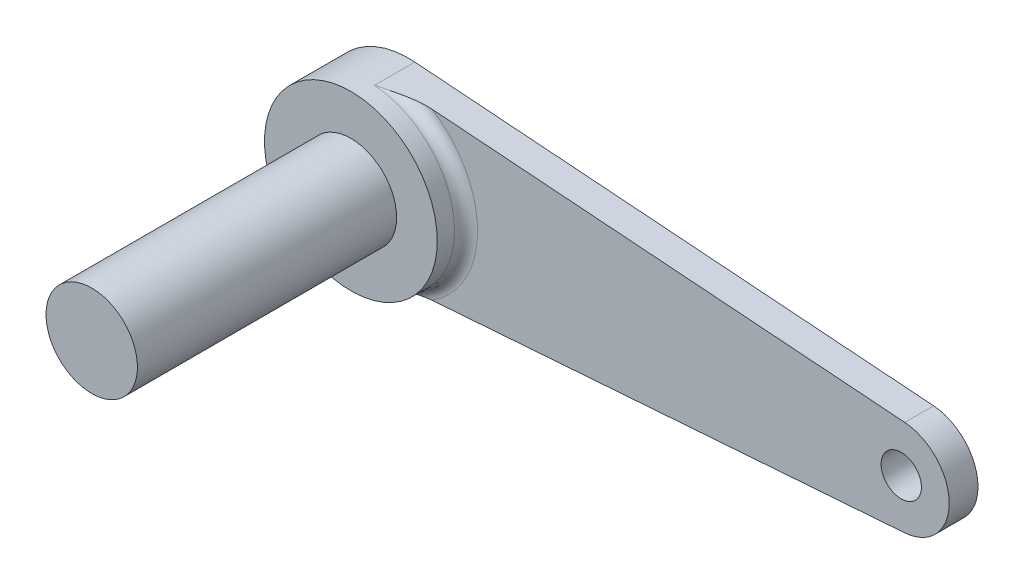
ISO-10303-21;
HEADER;
FILE_DESCRIPTION(('STEP AP214'),'2;1');
FILE_NAME('part.step','',(''),(''),'','','');
FILE_SCHEMA(('AUTOMOTIVE_DESIGN { 1 0 10303 214 1 1 1 1 }'));
ENDSEC;
DATA;
#1=APPLICATION_CONTEXT('core data for automotive mechanical design processes');
#2=APPLICATION_PROTOCOL_DEFINITION('international standard','automotive_design',2000,#1);
#3=PRODUCT_CONTEXT('',#1,'mechanical');
#4=PRODUCT('Part','Part','',(#3));
#5=PRODUCT_RELATED_PRODUCT_CATEGORY('part','',(#4));
#6=PRODUCT_DEFINITION_FORMATION('','',#4);
#7=PRODUCT_DEFINITION_CONTEXT('part definition',#1,'design');
#8=PRODUCT_DEFINITION('design','',#6,#7);
#9=PRODUCT_DEFINITION_SHAPE('','',#8);
#10=(LENGTH_UNIT() NAMED_UNIT(*) SI_UNIT(.MILLI.,.METRE.));
#11=(NAMED_UNIT(*) PLANE_ANGLE_UNIT() SI_UNIT($,.RADIAN.));
#12=(NAMED_UNIT(*) SI_UNIT($,.STERADIAN.) SOLID_ANGLE_UNIT());
#13=UNCERTAINTY_MEASURE_WITH_UNIT(LENGTH_MEASURE(1.E-05),#10,'distance_accuracy_value','');
#14=(GEOMETRIC_REPRESENTATION_CONTEXT(3) GLOBAL_UNCERTAINTY_ASSIGNED_CONTEXT((#13)) GLOBAL_UNIT_ASSIGNED_CONTEXT((#10,
#11,#12)) REPRESENTATION_CONTEXT('',''));
#15=CARTESIAN_POINT('',(0.,0.,0.));
#16=DIRECTION('',(0.,0.,1.));
#17=DIRECTION('',(1.,0.,0.));
#18=AXIS2_PLACEMENT_3D('',#15,#16,#17);
#19=CARTESIAN_POINT('',(115.004632121343,0.,-6.35));
#20=DIRECTION('',(0.,0.,1.));
#21=DIRECTION('',(1.,0.,0.));
#22=AXIS2_PLACEMENT_3D('',#19,#20,#21);
#23=CYLINDRICAL_SURFACE('',#22,10.5773290967231);
#24=CARTESIAN_POINT('',(115.004632121343,0.,0.));
#25=DIRECTION('',(0.,0.,1.));
#26=DIRECTION('',(1.,0.,0.));
#27=AXIS2_PLACEMENT_3D('',#24,#25,#26);
#28=CIRCLE('',#27,10.5773290967231);
#29=CARTESIAN_POINT('',(115.783889676618,-10.5485851412847,0.));
#30=VERTEX_POINT('',#29);
#31=CARTESIAN_POINT('',(115.783889676618,10.5485851412847,0.));
#32=VERTEX_POINT('',#31);
#33=EDGE_CURVE('E116',#30,#32,#28,.T.);
#34=ORIENTED_EDGE('',*,*,#33,.F.);
#35=DIRECTION('',(0.,0.,1.));
#36=VECTOR('',#35,1.);
#37=CARTESIAN_POINT('',(115.783889676618,-10.5485851412847,-6.35));
#38=LINE('',#37,#36);
#39=CARTESIAN_POINT('',(115.783889676618,-10.5485851412847,-6.35));
#40=VERTEX_POINT('',#39);
#41=EDGE_CURVE('E106',#40,#30,#38,.T.);
#42=ORIENTED_EDGE('',*,*,#41,.F.);
#43=CARTESIAN_POINT('',(115.004632121343,0.,-6.35));
#44=DIRECTION('',(0.,0.,1.));
#45=DIRECTION('',(1.,0.,0.));
#46=AXIS2_PLACEMENT_3D('',#43,#44,#45);
#47=CIRCLE('',#46,10.5773290967231);
#48=CARTESIAN_POINT('',(115.783889676618,10.5485851412847,-6.35));
#49=VERTEX_POINT('',#48);
#50=EDGE_CURVE('E100',#40,#49,#47,.T.);
#51=ORIENTED_EDGE('',*,*,#50,.T.);
#52=DIRECTION('',(0.,0.,1.));
#53=VECTOR('',#52,1.);
#54=CARTESIAN_POINT('',(115.783889676618,10.5485851412847,-6.35));
#55=LINE('',#54,#53);
#56=EDGE_CURVE('E83',#49,#32,#55,.T.);
#57=ORIENTED_EDGE('',*,*,#56,.T.);
#58=EDGE_LOOP('',(#34,#42,#51,#57));
#59=FACE_BOUND('',#58,.T.);
#60=ADVANCED_FACE('F33',(#59),#23,.T.);
#61=CARTESIAN_POINT('',(115.783889676618,-10.5485851412847,-6.35));
#62=DIRECTION('',(0.0736724316837717,-0.99728249398543,0.));
#63=DIRECTION('',(0.997282493985431,0.0736724316837717,0.));
#64=AXIS2_PLACEMENT_3D('',#61,#62,#63);
#65=PLANE('',#64);
#66=DIRECTION('',(0.99728249398543,0.0736724316837717,0.));
#67=VECTOR('',#66,1.);
#68=CARTESIAN_POINT('',(115.783889676618,-10.5485851412847,0.));
#69=LINE('',#68,#67);
#70=CARTESIAN_POINT('',(11.5358499624678,-18.2497196045153,0.));
#71=VERTEX_POINT('',#70);
#72=EDGE_CURVE('E107',#71,#30,#69,.T.);
#73=ORIENTED_EDGE('',*,*,#72,.F.);
#74=CARTESIAN_POINT('',(11.5358499624678,-18.2497196045153,0.));
#75=CARTESIAN_POINT('',(11.3263552728227,-18.2651956439566,4.40820866643235E-05));
#76=CARTESIAN_POINT('',(11.1169330024198,-18.2806663335579,0.00576835791585236));
#77=CARTESIAN_POINT('',(10.6987143387816,-18.3115614772224,0.0272436311916478));
#78=CARTESIAN_POINT('',(10.4899176483441,-18.3269859532409,0.0429886887449002));
#79=CARTESIAN_POINT('',(10.0737225631182,-18.357731608728,0.0831229510708153));
#80=CARTESIAN_POINT('',(9.86632194634032,-18.3730529523421,0.107489633365191));
#81=CARTESIAN_POINT('',(9.45252782612067,-18.4036212409032,0.16381906514684));
#82=CARTESIAN_POINT('',(9.24613449531042,-18.4188681730972,0.195783073044917));
#83=CARTESIAN_POINT('',(8.63203612746358,-18.4642335738991,0.30106018363743));
#84=CARTESIAN_POINT('',(8.22598457162461,-18.4942298945886,0.384121697085393));
#85=CARTESIAN_POINT('',(7.41831497568467,-18.5538950180504,0.570383853204976));
#86=CARTESIAN_POINT('',(7.01670049821303,-18.5835635576399,0.673599589569155));
#87=CARTESIAN_POINT('',(6.17786089399503,-18.6455313088119,0.906357551626464));
#88=CARTESIAN_POINT('',(5.74108165748504,-18.6777975810634,1.03749909426332));
#89=CARTESIAN_POINT('',(4.87178900140877,-18.742014996093,1.31281877316906));
#90=CARTESIAN_POINT('',(4.43927470866702,-18.7739662033752,1.45699417682133));
#91=CARTESIAN_POINT('',(3.14465855780675,-18.8696036185572,1.90254999096676));
#92=CARTESIAN_POINT('',(2.2869276206066,-18.9329669326181,2.21652489149362));
#93=CARTESIAN_POINT('',(1.42069935381665,-18.9969579714587,2.53368787119678));
#94=CARTESIAN_POINT('',(1.41207958540444,-18.9975947411838,2.53684394248119));
#95=CARTESIAN_POINT('',(1.40345982357585,-18.9982315104225,2.54));
#96=B_SPLINE_CURVE_WITH_KNOTS('',3,(#74,#75,#76,#77,#78,#79,#80,#81,#82,#83,#84,#85,#86,#87,#88,
#89,#90,#91,#92,#93,#94,#95),.UNSPECIFIED.,.F.,.F.,(4,2,2,2,2,2,2,2,2,2,4),(0.,
0.630016056049882,1.25965901274197,1.88766913637385,2.51578335534008,3.76166326186585,
5.00847982351015,6.37972131099221,7.75067597436287,10.4971173591688,10.5247217066713),.UNSPECIFIED.);
#97=CARTESIAN_POINT('',(1.40345982357584,-18.9982315104225,2.54));
#98=VERTEX_POINT('',#97);
#99=EDGE_CURVE('E11',#71,#98,#96,.T.);
#100=ORIENTED_EDGE('',*,*,#99,.T.);
#101=DIRECTION('',(0.,0.,1.));
#102=VECTOR('',#101,1.);
#103=CARTESIAN_POINT('',(1.40345982357584,-18.9982315104225,-6.35));
#104=LINE('',#103,#102);
#105=CARTESIAN_POINT('',(1.40345982357584,-18.9982315104225,-6.35));
#106=VERTEX_POINT('',#105);
#107=EDGE_CURVE('E119',#106,#98,#104,.T.);
#108=ORIENTED_EDGE('',*,*,#107,.F.);
#109=DIRECTION('',(0.99728249398543,0.0736724316837717,0.));
#110=VECTOR('',#109,1.);
#111=CARTESIAN_POINT('',(115.783889676618,-10.5485851412847,-6.35));
#112=LINE('',#111,#110);
#113=EDGE_CURVE('E93',#106,#40,#112,.T.);
#114=ORIENTED_EDGE('',*,*,#113,.T.);
#115=ORIENTED_EDGE('',*,*,#41,.T.);
#116=EDGE_LOOP('',(#73,#100,#108,#114,#115));
#117=FACE_BOUND('',#116,.T.);
#118=ADVANCED_FACE('F142',(#117),#65,.T.);
#119=CARTESIAN_POINT('',(0.,0.,-6.35));
#120=DIRECTION('',(0.,0.,1.));
#121=DIRECTION('',(1.,0.,0.));
#122=AXIS2_PLACEMENT_3D('',#119,#120,#121);
#123=CYLINDRICAL_SURFACE('',#122,19.05);
#124=CARTESIAN_POINT('',(0.,0.,2.54));
#125=DIRECTION('',(0.,0.,1.));
#126=DIRECTION('',(1.,0.,0.));
#127=AXIS2_PLACEMENT_3D('',#124,#125,#126);
#128=CIRCLE('',#127,19.05);
#129=CARTESIAN_POINT('',(1.40345982357585,18.9982315104225,2.54));
#130=VERTEX_POINT('',#129);
#131=EDGE_CURVE('E118',#98,#130,#128,.T.);
#132=ORIENTED_EDGE('',*,*,#131,.T.);
#133=DIRECTION('',(0.,0.,1.));
#134=VECTOR('',#133,1.);
#135=CARTESIAN_POINT('',(1.40345982357585,18.9982315104225,-6.35));
#136=LINE('',#135,#134);
#137=CARTESIAN_POINT('',(1.40345982357585,18.9982315104225,-6.35));
#138=VERTEX_POINT('',#137);
#139=EDGE_CURVE('E92',#138,#130,#136,.T.);
#140=ORIENTED_EDGE('',*,*,#139,.F.);
#141=CARTESIAN_POINT('',(0.,0.,-6.35));
#142=DIRECTION('',(0.,0.,1.));
#143=DIRECTION('',(1.,0.,0.));
#144=AXIS2_PLACEMENT_3D('',#141,#142,#143);
#145=CIRCLE('',#144,19.05);
#146=EDGE_CURVE('E103',#138,#106,#145,.T.);
#147=ORIENTED_EDGE('',*,*,#146,.T.);
#148=ORIENTED_EDGE('',*,*,#107,.T.);
#149=EDGE_LOOP('',(#132,#140,#147,#148));
#150=FACE_BOUND('',#149,.T.);
#151=CARTESIAN_POINT('',(0.,0.,6.35));
#152=DIRECTION('',(0.,0.,1.));
#153=DIRECTION('',(1.,0.,0.));
#154=AXIS2_PLACEMENT_3D('',#151,#152,#153);
#155=CIRCLE('',#154,19.05);
#156=CARTESIAN_POINT('',(19.05,0.,6.35));
#157=VERTEX_POINT('',#156);
#158=EDGE_CURVE('E111',#157,#157,#155,.T.);
#159=ORIENTED_EDGE('',*,*,#158,.F.);
#160=EDGE_LOOP('',(#159));
#161=FACE_BOUND('',#160,.T.);
#162=ADVANCED_FACE('F140',(#150,#161),#123,.T.);
#163=CARTESIAN_POINT('',(115.783889676618,10.5485851412847,-6.35));
#164=DIRECTION('',(0.0736724316837718,0.99728249398543,0.));
#165=DIRECTION('',(-0.99728249398543,0.0736724316837718,0.));
#166=AXIS2_PLACEMENT_3D('',#163,#164,#165);
#167=PLANE('',#166);
#168=DIRECTION('',(-0.99728249398543,0.0736724316837718,0.));
#169=VECTOR('',#168,1.);
#170=CARTESIAN_POINT('',(115.783889676618,10.5485851412847,0.));
#171=LINE('',#170,#169);
#172=CARTESIAN_POINT('',(11.5358499624678,18.2497196045153,0.));
#173=VERTEX_POINT('',#172);
#174=EDGE_CURVE('E87',#32,#173,#171,.T.);
#175=ORIENTED_EDGE('',*,*,#174,.F.);
#176=ORIENTED_EDGE('',*,*,#56,.F.);
#177=DIRECTION('',(-0.99728249398543,0.0736724316837718,0.));
#178=VECTOR('',#177,1.);
#179=CARTESIAN_POINT('',(115.783889676618,10.5485851412847,-6.35));
#180=LINE('',#179,#178);
#181=EDGE_CURVE('E86',#49,#138,#180,.T.);
#182=ORIENTED_EDGE('',*,*,#181,.T.);
#183=ORIENTED_EDGE('',*,*,#139,.T.);
#184=CARTESIAN_POINT('',(11.5358499624678,18.2497196045153,0.));
#185=CARTESIAN_POINT('',(11.3263552728235,18.2651956439565,4.40820866633155E-05));
#186=CARTESIAN_POINT('',(11.1169330024215,18.2806663335578,0.00576835791580651));
#187=CARTESIAN_POINT('',(10.6987143387849,18.3115614772222,0.0272436311914382));
#188=CARTESIAN_POINT('',(10.4899176483482,18.3269859532405,0.0429886887445717));
#189=CARTESIAN_POINT('',(10.0737225631238,18.3577316087276,0.0831229510702051));
#190=CARTESIAN_POINT('',(9.86632194634656,18.3730529523417,0.107489633364426));
#191=CARTESIAN_POINT('',(9.45252782612818,18.4036212409026,0.163819065145732));
#192=CARTESIAN_POINT('',(9.24613449531857,18.4188681730966,0.195783073043623));
#193=CARTESIAN_POINT('',(8.63203612747078,18.4642335738986,0.301060183635985));
#194=CARTESIAN_POINT('',(8.22598457163022,18.4942298945882,0.384121697084088));
#195=CARTESIAN_POINT('',(7.41831497568741,18.5538950180502,0.570383853204353));
#196=CARTESIAN_POINT('',(7.01670049821448,18.5835635576398,0.673599589569066));
#197=CARTESIAN_POINT('',(6.17786089399481,18.6455313088119,0.906357551626179));
#198=CARTESIAN_POINT('',(5.74108165748438,18.6777975810635,1.03749909426216));
#199=CARTESIAN_POINT('',(4.87178900140862,18.742014996093,1.31281877317048));
#200=CARTESIAN_POINT('',(4.43927470866781,18.7739662033752,1.45699417682622));
#201=CARTESIAN_POINT('',(3.14465855780265,18.8696036185575,1.90254999095784));
#202=CARTESIAN_POINT('',(2.28692762058796,18.9329669326196,2.21652489144343));
#203=CARTESIAN_POINT('',(1.42069935381634,18.9969579714588,2.53368787119575));
#204=CARTESIAN_POINT('',(1.41207958540429,18.9975947411838,2.53684394248067));
#205=CARTESIAN_POINT('',(1.40345982357585,18.9982315104225,2.54));
#206=B_SPLINE_CURVE_WITH_KNOTS('',3,(#184,#185,#186,#187,#188,#189,#190,#191,#192,#193,#194,
#195,#196,#197,#198,#199,#200,#201,#202,#203,#204,#205),.UNSPECIFIED.,.F.,.F.,(4,2,2,2,2,2,2,2,
2,2,4),(0.,0.630016056047389,1.25965901273698,1.88766913636689,2.51578335533115,
3.76166326186163,5.00847982351015,6.37972131099253,7.7506759743641,10.4971173591688,
10.5247217066713),.UNSPECIFIED.);
#207=EDGE_CURVE('E46',#130,#173,#206,.F.);
#208=ORIENTED_EDGE('',*,*,#207,.T.);
#209=EDGE_LOOP('',(#175,#176,#182,#183,#208));
#210=FACE_BOUND('',#209,.T.);
#211=ADVANCED_FACE('F85',(#210),#167,.T.);
#212=CARTESIAN_POINT('',(115.004632121343,0.,-6.35));
#213=DIRECTION('',(0.,0.,1.));
#214=DIRECTION('',(1.,0.,0.));
#215=AXIS2_PLACEMENT_3D('',#212,#213,#214);
#216=PLANE('',#215);
#217=CARTESIAN_POINT('',(115.004632121343,0.,-6.35));
#218=DIRECTION('',(0.,0.,1.));
#219=DIRECTION('',(1.,0.,0.));
#220=AXIS2_PLACEMENT_3D('',#217,#218,#219);
#221=CIRCLE('',#220,4.44532412047326);
#222=CARTESIAN_POINT('',(119.449956241816,0.,-6.35));
#223=VERTEX_POINT('',#222);
#224=EDGE_CURVE('E184',#223,#223,#221,.T.);
#225=ORIENTED_EDGE('',*,*,#224,.T.);
#226=EDGE_LOOP('',(#225));
#227=FACE_BOUND('',#226,.T.);
#228=ORIENTED_EDGE('',*,*,#50,.F.);
#229=ORIENTED_EDGE('',*,*,#113,.F.);
#230=ORIENTED_EDGE('',*,*,#146,.F.);
#231=ORIENTED_EDGE('',*,*,#181,.F.);
#232=EDGE_LOOP('',(#228,#229,#230,#231));
#233=FACE_BOUND('',#232,.T.);
#234=ADVANCED_FACE('F98',(#227,#233),#216,.F.);
#235=CARTESIAN_POINT('',(115.004632121343,0.,0.));
#236=DIRECTION('',(0.,0.,1.));
#237=DIRECTION('',(1.,0.,0.));
#238=AXIS2_PLACEMENT_3D('',#235,#236,#237);
#239=PLANE('',#238);
#240=CARTESIAN_POINT('',(115.004632121343,0.,0.));
#241=DIRECTION('',(0.,0.,1.));
#242=DIRECTION('',(1.,0.,0.));
#243=AXIS2_PLACEMENT_3D('',#240,#241,#242);
#244=CIRCLE('',#243,4.44532412047326);
#245=CARTESIAN_POINT('',(119.449956241816,0.,0.));
#246=VERTEX_POINT('',#245);
#247=EDGE_CURVE('E181',#246,#246,#244,.T.);
#248=ORIENTED_EDGE('',*,*,#247,.F.);
#249=EDGE_LOOP('',(#248));
#250=FACE_BOUND('',#249,.T.);
#251=ORIENTED_EDGE('',*,*,#174,.T.);
#252=CARTESIAN_POINT('',(0.,0.,0.));
#253=DIRECTION('',(0.,0.,1.));
#254=DIRECTION('',(1.,0.,0.));
#255=AXIS2_PLACEMENT_3D('',#252,#253,#254);
#256=CIRCLE('',#255,21.59);
#257=EDGE_CURVE('E59',#173,#71,#256,.F.);
#258=ORIENTED_EDGE('',*,*,#257,.T.);
#259=ORIENTED_EDGE('',*,*,#72,.T.);
#260=ORIENTED_EDGE('',*,*,#33,.T.);
#261=EDGE_LOOP('',(#251,#258,#259,#260));
#262=FACE_BOUND('',#261,.T.);
#263=ADVANCED_FACE('F153',(#250,#262),#239,.T.);
#264=CARTESIAN_POINT('',(0.,0.,6.35));
#265=DIRECTION('',(0.,0.,1.));
#266=DIRECTION('',(1.,0.,0.));
#267=AXIS2_PLACEMENT_3D('',#264,#265,#266);
#268=PLANE('',#267);
#269=CARTESIAN_POINT('',(0.,0.,6.35));
#270=DIRECTION('',(0.,0.,1.));
#271=DIRECTION('',(1.,0.,0.));
#272=AXIS2_PLACEMENT_3D('',#269,#270,#271);
#273=CIRCLE('',#272,10.0799591649042);
#274=CARTESIAN_POINT('',(10.0799591649042,0.,6.35));
#275=VERTEX_POINT('',#274);
#276=EDGE_CURVE('E188',#275,#275,#273,.T.);
#277=ORIENTED_EDGE('',*,*,#276,.F.);
#278=EDGE_LOOP('',(#277));
#279=FACE_BOUND('',#278,.T.);
#280=ORIENTED_EDGE('',*,*,#158,.T.);
#281=EDGE_LOOP('',(#280));
#282=FACE_BOUND('',#281,.T.);
#283=ADVANCED_FACE('F156',(#279,#282),#268,.T.);
#284=CARTESIAN_POINT('',(115.004632121343,0.,-6.35));
#285=DIRECTION('',(0.,0.,1.));
#286=DIRECTION('',(1.,0.,0.));
#287=AXIS2_PLACEMENT_3D('',#284,#285,#286);
#288=CYLINDRICAL_SURFACE('',#287,4.44532412047326);
#289=ORIENTED_EDGE('',*,*,#224,.F.);
#290=EDGE_LOOP('',(#289));
#291=FACE_BOUND('',#290,.T.);
#292=ORIENTED_EDGE('',*,*,#247,.T.);
#293=EDGE_LOOP('',(#292));
#294=FACE_BOUND('',#293,.T.);
#295=ADVANCED_FACE('F163',(#291,#294),#288,.F.);
#296=CARTESIAN_POINT('',(0.,0.,2.54));
#297=DIRECTION('',(0.,0.,1.));
#298=DIRECTION('',(1.,0.,0.));
#299=AXIS2_PLACEMENT_3D('',#296,#297,#298);
#300=TOROIDAL_SURFACE('',#299,21.59,2.54);
#301=ORIENTED_EDGE('',*,*,#99,.F.);
#302=ORIENTED_EDGE('',*,*,#257,.F.);
#303=ORIENTED_EDGE('',*,*,#207,.F.);
#304=ORIENTED_EDGE('',*,*,#131,.F.);
#305=EDGE_LOOP('',(#301,#302,#303,#304));
#306=FACE_BOUND('',#305,.T.);
#307=ADVANCED_FACE('F35',(#306),#300,.F.);
#308=CARTESIAN_POINT('',(0.,0.,63.5));
#309=DIRECTION('',(0.,0.,-1.));
#310=DIRECTION('',(-1.,0.,0.));
#311=AXIS2_PLACEMENT_3D('',#308,#309,#310);
#312=CYLINDRICAL_SURFACE('',#311,10.0799591649042);
#313=ORIENTED_EDGE('',*,*,#276,.T.);
#314=EDGE_LOOP('',(#313));
#315=FACE_BOUND('',#314,.T.);
#316=CARTESIAN_POINT('',(0.,0.,63.5));
#317=DIRECTION('',(0.,0.,-1.));
#318=DIRECTION('',(-1.,0.,0.));
#319=AXIS2_PLACEMENT_3D('',#316,#317,#318);
#320=CIRCLE('',#319,10.0799591649042);
#321=CARTESIAN_POINT('',(-10.0799591649042,0.,63.5));
#322=VERTEX_POINT('',#321);
#323=EDGE_CURVE('E179',#322,#322,#320,.T.);
#324=ORIENTED_EDGE('',*,*,#323,.T.);
#325=EDGE_LOOP('',(#324));
#326=FACE_BOUND('',#325,.T.);
#327=ADVANCED_FACE('F168',(#315,#326),#312,.T.);
#328=CARTESIAN_POINT('',(0.,0.,63.5));
#329=DIRECTION('',(0.,0.,-1.));
#330=DIRECTION('',(-1.,0.,0.));
#331=AXIS2_PLACEMENT_3D('',#328,#329,#330);
#332=PLANE('',#331);
#333=ORIENTED_EDGE('',*,*,#323,.F.);
#334=EDGE_LOOP('',(#333));
#335=FACE_BOUND('',#334,.T.);
#336=ADVANCED_FACE('F171',(#335),#332,.F.);
#337=CLOSED_SHELL('',(#60,#118,#162,#211,#234,#263,#283,#295,#307,#327,#336));
#338=MANIFOLD_SOLID_BREP('B2',#337);
#339=ADVANCED_BREP_SHAPE_REPRESENTATION('',(#18,#338),#14);
#340=SHAPE_DEFINITION_REPRESENTATION(#9,#339);
ENDSEC;
END-ISO-10303-21;
